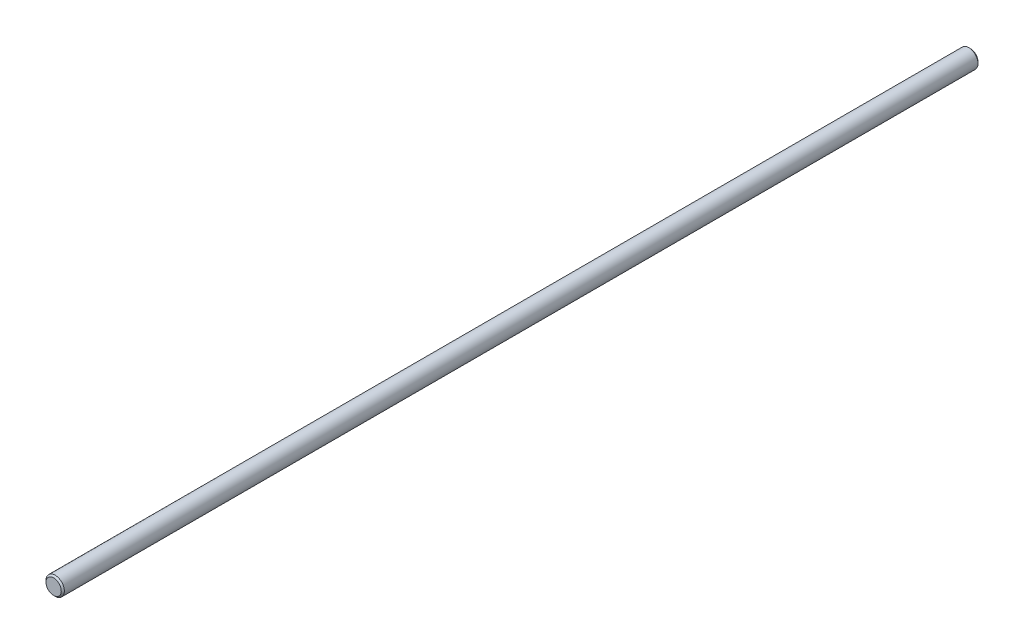
ISO-10303-21;
HEADER;
FILE_DESCRIPTION(('STEP AP214'),'2;1');
FILE_NAME('part.step','',(''),(''),'','','');
FILE_SCHEMA(('AUTOMOTIVE_DESIGN { 1 0 10303 214 1 1 1 1 }'));
ENDSEC;
DATA;
#1=APPLICATION_CONTEXT('core data for automotive mechanical design processes');
#2=APPLICATION_PROTOCOL_DEFINITION('international standard','automotive_design',2000,#1);
#3=PRODUCT_CONTEXT('',#1,'mechanical');
#4=PRODUCT('Part','Part','',(#3));
#5=PRODUCT_RELATED_PRODUCT_CATEGORY('part','',(#4));
#6=PRODUCT_DEFINITION_FORMATION('','',#4);
#7=PRODUCT_DEFINITION_CONTEXT('part definition',#1,'design');
#8=PRODUCT_DEFINITION('design','',#6,#7);
#9=PRODUCT_DEFINITION_SHAPE('','',#8);
#10=(LENGTH_UNIT() NAMED_UNIT(*) SI_UNIT(.MILLI.,.METRE.));
#11=(NAMED_UNIT(*) PLANE_ANGLE_UNIT() SI_UNIT($,.RADIAN.));
#12=(NAMED_UNIT(*) SI_UNIT($,.STERADIAN.) SOLID_ANGLE_UNIT());
#13=UNCERTAINTY_MEASURE_WITH_UNIT(LENGTH_MEASURE(1.E-05),#10,'distance_accuracy_value','');
#14=(GEOMETRIC_REPRESENTATION_CONTEXT(3) GLOBAL_UNCERTAINTY_ASSIGNED_CONTEXT((#13)) GLOBAL_UNIT_ASSIGNED_CONTEXT((#10,
#11,#12)) REPRESENTATION_CONTEXT('',''));
#15=CARTESIAN_POINT('',(0.,0.,0.));
#16=DIRECTION('',(0.,0.,1.));
#17=DIRECTION('',(1.,0.,0.));
#18=AXIS2_PLACEMENT_3D('',#15,#16,#17);
#19=CARTESIAN_POINT('',(0.,0.,300.));
#20=DIRECTION('',(0.,0.,-1.));
#21=DIRECTION('',(-1.,0.,0.));
#22=AXIS2_PLACEMENT_3D('',#19,#20,#21);
#23=CYLINDRICAL_SURFACE('',#22,3.);
#24=CARTESIAN_POINT('',(0.,0.,0.5));
#25=DIRECTION('',(0.,0.,1.));
#26=DIRECTION('',(1.,0.,0.));
#27=AXIS2_PLACEMENT_3D('',#24,#25,#26);
#28=CIRCLE('',#27,3.);
#29=CARTESIAN_POINT('',(3.,0.,0.5));
#30=VERTEX_POINT('',#29);
#31=EDGE_CURVE('E40',#30,#30,#28,.T.);
#32=ORIENTED_EDGE('',*,*,#31,.T.);
#33=EDGE_LOOP('',(#32));
#34=FACE_BOUND('',#33,.T.);
#35=CARTESIAN_POINT('',(0.,0.,299.5));
#36=DIRECTION('',(0.,0.,1.));
#37=DIRECTION('',(1.,0.,0.));
#38=AXIS2_PLACEMENT_3D('',#35,#36,#37);
#39=CIRCLE('',#38,3.);
#40=CARTESIAN_POINT('',(3.,0.,299.5));
#41=VERTEX_POINT('',#40);
#42=EDGE_CURVE('E44',#41,#41,#39,.F.);
#43=ORIENTED_EDGE('',*,*,#42,.T.);
#44=EDGE_LOOP('',(#43));
#45=FACE_BOUND('',#44,.T.);
#46=ADVANCED_FACE('F29',(#34,#45),#23,.T.);
#47=CARTESIAN_POINT('',(0.,0.,300.));
#48=DIRECTION('',(0.,0.,1.));
#49=DIRECTION('',(1.,0.,0.));
#50=AXIS2_PLACEMENT_3D('',#47,#48,#49);
#51=PLANE('',#50);
#52=CARTESIAN_POINT('',(0.,0.,300.));
#53=DIRECTION('',(0.,0.,1.));
#54=DIRECTION('',(1.,0.,0.));
#55=AXIS2_PLACEMENT_3D('',#52,#53,#54);
#56=CIRCLE('',#55,2.50000000000003);
#57=CARTESIAN_POINT('',(2.50000000000003,0.,300.));
#58=VERTEX_POINT('',#57);
#59=EDGE_CURVE('E10',#58,#58,#56,.T.);
#60=ORIENTED_EDGE('',*,*,#59,.T.);
#61=EDGE_LOOP('',(#60));
#62=FACE_BOUND('',#61,.T.);
#63=ADVANCED_FACE('F60',(#62),#51,.T.);
#64=CARTESIAN_POINT('',(0.,0.,0.));
#65=DIRECTION('',(0.,0.,1.));
#66=DIRECTION('',(1.,0.,0.));
#67=AXIS2_PLACEMENT_3D('',#64,#65,#66);
#68=PLANE('',#67);
#69=CARTESIAN_POINT('',(0.,0.,0.));
#70=DIRECTION('',(0.,0.,1.));
#71=DIRECTION('',(1.,0.,0.));
#72=AXIS2_PLACEMENT_3D('',#69,#70,#71);
#73=CIRCLE('',#72,2.50000000000003);
#74=CARTESIAN_POINT('',(2.50000000000003,0.,0.));
#75=VERTEX_POINT('',#74);
#76=EDGE_CURVE('E36',#75,#75,#73,.F.);
#77=ORIENTED_EDGE('',*,*,#76,.T.);
#78=EDGE_LOOP('',(#77));
#79=FACE_BOUND('',#78,.T.);
#80=ADVANCED_FACE('F57',(#79),#68,.F.);
#81=CARTESIAN_POINT('',(0.,0.,0.5));
#82=DIRECTION('',(0.,0.,1.));
#83=DIRECTION('',(1.,0.,0.));
#84=AXIS2_PLACEMENT_3D('',#81,#82,#83);
#85=CONICAL_SURFACE('',#84,3.,0.785398163397418);
#86=ORIENTED_EDGE('',*,*,#76,.F.);
#87=EDGE_LOOP('',(#86));
#88=FACE_BOUND('',#87,.T.);
#89=ORIENTED_EDGE('',*,*,#31,.F.);
#90=EDGE_LOOP('',(#89));
#91=FACE_BOUND('',#90,.T.);
#92=ADVANCED_FACE('F53',(#88,#91),#85,.T.);
#93=CARTESIAN_POINT('',(0.,0.,300.));
#94=DIRECTION('',(0.,0.,-1.));
#95=DIRECTION('',(-1.,0.,0.));
#96=AXIS2_PLACEMENT_3D('',#93,#94,#95);
#97=CONICAL_SURFACE('',#96,2.50000000000003,0.785398163397474);
#98=ORIENTED_EDGE('',*,*,#42,.F.);
#99=EDGE_LOOP('',(#98));
#100=FACE_BOUND('',#99,.T.);
#101=ORIENTED_EDGE('',*,*,#59,.F.);
#102=EDGE_LOOP('',(#101));
#103=FACE_BOUND('',#102,.T.);
#104=ADVANCED_FACE('F31',(#100,#103),#97,.T.);
#105=CLOSED_SHELL('',(#46,#63,#80,#92,#104));
#106=MANIFOLD_SOLID_BREP('B2',#105);
#107=ADVANCED_BREP_SHAPE_REPRESENTATION('',(#18,#106),#14);
#108=SHAPE_DEFINITION_REPRESENTATION(#9,#107);
ENDSEC;
END-ISO-10303-21;
